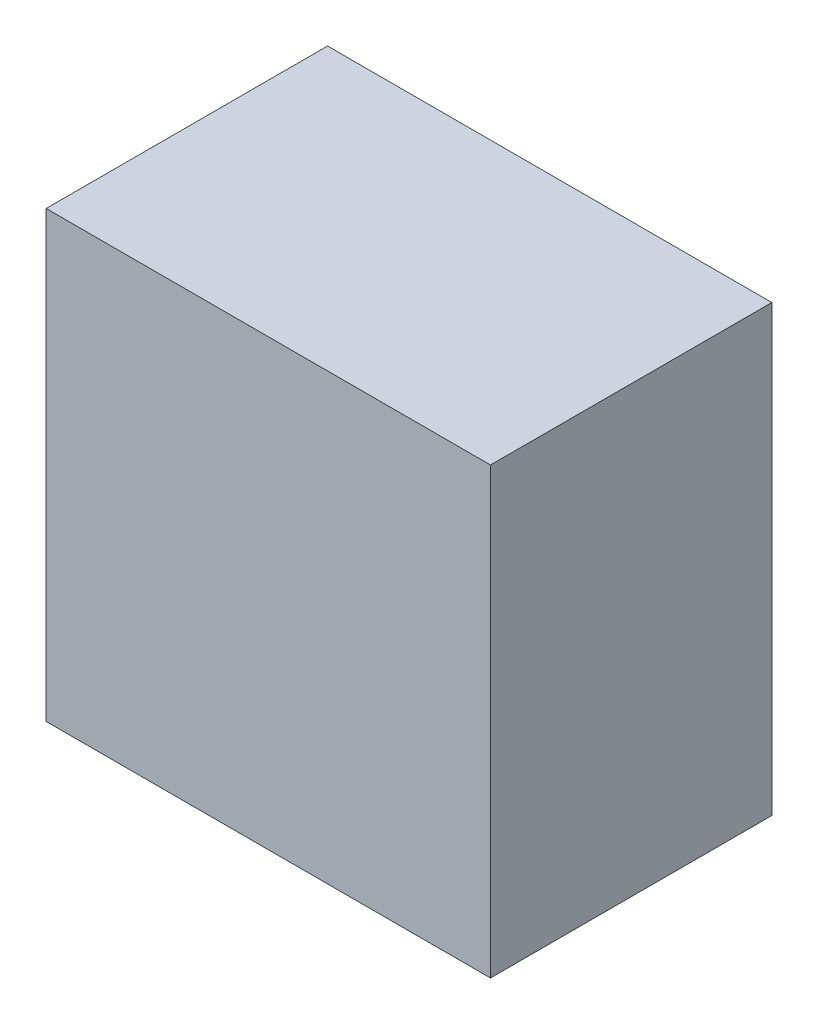
ISO-10303-21;
HEADER;
FILE_DESCRIPTION(('STEP AP214'),'2;1');
FILE_NAME('part.step','',(''),(''),'','','');
FILE_SCHEMA(('AUTOMOTIVE_DESIGN { 1 0 10303 214 1 1 1 1 }'));
ENDSEC;
DATA;
#1=APPLICATION_CONTEXT('core data for automotive mechanical design processes');
#2=APPLICATION_PROTOCOL_DEFINITION('international standard','automotive_design',2000,#1);
#3=PRODUCT_CONTEXT('',#1,'mechanical');
#4=PRODUCT('Part','Part','',(#3));
#5=PRODUCT_RELATED_PRODUCT_CATEGORY('part','',(#4));
#6=PRODUCT_DEFINITION_FORMATION('','',#4);
#7=PRODUCT_DEFINITION_CONTEXT('part definition',#1,'design');
#8=PRODUCT_DEFINITION('design','',#6,#7);
#9=PRODUCT_DEFINITION_SHAPE('','',#8);
#10=(LENGTH_UNIT() NAMED_UNIT(*) SI_UNIT(.MILLI.,.METRE.));
#11=(NAMED_UNIT(*) PLANE_ANGLE_UNIT() SI_UNIT($,.RADIAN.));
#12=(NAMED_UNIT(*) SI_UNIT($,.STERADIAN.) SOLID_ANGLE_UNIT());
#13=UNCERTAINTY_MEASURE_WITH_UNIT(LENGTH_MEASURE(1.E-05),#10,'distance_accuracy_value','');
#14=(GEOMETRIC_REPRESENTATION_CONTEXT(3) GLOBAL_UNCERTAINTY_ASSIGNED_CONTEXT((#13)) GLOBAL_UNIT_ASSIGNED_CONTEXT((#10,
#11,#12)) REPRESENTATION_CONTEXT('',''));
#15=CARTESIAN_POINT('',(0.,0.,0.));
#16=DIRECTION('',(0.,0.,1.));
#17=DIRECTION('',(1.,0.,0.));
#18=AXIS2_PLACEMENT_3D('',#15,#16,#17);
#19=CARTESIAN_POINT('',(30.,-30.,38.));
#20=DIRECTION('',(-1.,0.,0.));
#21=DIRECTION('',(0.,0.,1.));
#22=AXIS2_PLACEMENT_3D('',#19,#20,#21);
#23=PLANE('',#22);
#24=DIRECTION('',(0.,1.,0.));
#25=VECTOR('',#24,1.);
#26=CARTESIAN_POINT('',(30.,-30.,0.));
#27=LINE('',#26,#25);
#28=CARTESIAN_POINT('',(30.,-30.,0.));
#29=VERTEX_POINT('',#28);
#30=CARTESIAN_POINT('',(30.,30.,0.));
#31=VERTEX_POINT('',#30);
#32=EDGE_CURVE('E111',#29,#31,#27,.T.);
#33=ORIENTED_EDGE('',*,*,#32,.T.);
#34=DIRECTION('',(0.,0.,-1.));
#35=VECTOR('',#34,1.);
#36=CARTESIAN_POINT('',(30.,30.,38.));
#37=LINE('',#36,#35);
#38=CARTESIAN_POINT('',(30.,30.,38.));
#39=VERTEX_POINT('',#38);
#40=EDGE_CURVE('E11',#39,#31,#37,.T.);
#41=ORIENTED_EDGE('',*,*,#40,.F.);
#42=DIRECTION('',(0.,1.,0.));
#43=VECTOR('',#42,1.);
#44=CARTESIAN_POINT('',(30.,-30.,38.));
#45=LINE('',#44,#43);
#46=CARTESIAN_POINT('',(30.,-30.,38.));
#47=VERTEX_POINT('',#46);
#48=EDGE_CURVE('E95',#47,#39,#45,.T.);
#49=ORIENTED_EDGE('',*,*,#48,.F.);
#50=DIRECTION('',(0.,0.,-1.));
#51=VECTOR('',#50,1.);
#52=CARTESIAN_POINT('',(30.,-30.,38.));
#53=LINE('',#52,#51);
#54=EDGE_CURVE('E107',#47,#29,#53,.T.);
#55=ORIENTED_EDGE('',*,*,#54,.T.);
#56=EDGE_LOOP('',(#33,#41,#49,#55));
#57=FACE_BOUND('',#56,.T.);
#58=ADVANCED_FACE('F43',(#57),#23,.F.);
#59=CARTESIAN_POINT('',(-30.,30.,38.));
#60=DIRECTION('',(0.,-1.,0.));
#61=DIRECTION('',(0.,0.,-1.));
#62=AXIS2_PLACEMENT_3D('',#59,#60,#61);
#63=PLANE('',#62);
#64=DIRECTION('',(-1.,0.,0.));
#65=VECTOR('',#64,1.);
#66=CARTESIAN_POINT('',(-30.,30.,0.));
#67=LINE('',#66,#65);
#68=CARTESIAN_POINT('',(-30.,30.,0.));
#69=VERTEX_POINT('',#68);
#70=EDGE_CURVE('E100',#31,#69,#67,.T.);
#71=ORIENTED_EDGE('',*,*,#70,.T.);
#72=DIRECTION('',(0.,0.,-1.));
#73=VECTOR('',#72,1.);
#74=CARTESIAN_POINT('',(-30.,30.,38.));
#75=LINE('',#74,#73);
#76=CARTESIAN_POINT('',(-30.,30.,38.));
#77=VERTEX_POINT('',#76);
#78=EDGE_CURVE('E52',#77,#69,#75,.T.);
#79=ORIENTED_EDGE('',*,*,#78,.F.);
#80=DIRECTION('',(-1.,0.,0.));
#81=VECTOR('',#80,1.);
#82=CARTESIAN_POINT('',(-30.,30.,38.));
#83=LINE('',#82,#81);
#84=EDGE_CURVE('E90',#39,#77,#83,.T.);
#85=ORIENTED_EDGE('',*,*,#84,.F.);
#86=ORIENTED_EDGE('',*,*,#40,.T.);
#87=EDGE_LOOP('',(#71,#79,#85,#86));
#88=FACE_BOUND('',#87,.T.);
#89=ADVANCED_FACE('F99',(#88),#63,.F.);
#90=CARTESIAN_POINT('',(-30.,-30.,38.));
#91=DIRECTION('',(1.,0.,0.));
#92=DIRECTION('',(0.,0.,-1.));
#93=AXIS2_PLACEMENT_3D('',#90,#91,#92);
#94=PLANE('',#93);
#95=DIRECTION('',(0.,-1.,0.));
#96=VECTOR('',#95,1.);
#97=CARTESIAN_POINT('',(-30.,-30.,0.));
#98=LINE('',#97,#96);
#99=CARTESIAN_POINT('',(-30.,-30.,0.));
#100=VERTEX_POINT('',#99);
#101=EDGE_CURVE('E77',#69,#100,#98,.T.);
#102=ORIENTED_EDGE('',*,*,#101,.T.);
#103=DIRECTION('',(0.,0.,-1.));
#104=VECTOR('',#103,1.);
#105=CARTESIAN_POINT('',(-30.,-30.,38.));
#106=LINE('',#105,#104);
#107=CARTESIAN_POINT('',(-30.,-30.,38.));
#108=VERTEX_POINT('',#107);
#109=EDGE_CURVE('E102',#108,#100,#106,.T.);
#110=ORIENTED_EDGE('',*,*,#109,.F.);
#111=DIRECTION('',(0.,-1.,0.));
#112=VECTOR('',#111,1.);
#113=CARTESIAN_POINT('',(-30.,-30.,38.));
#114=LINE('',#113,#112);
#115=EDGE_CURVE('E93',#77,#108,#114,.T.);
#116=ORIENTED_EDGE('',*,*,#115,.F.);
#117=ORIENTED_EDGE('',*,*,#78,.T.);
#118=EDGE_LOOP('',(#102,#110,#116,#117));
#119=FACE_BOUND('',#118,.T.);
#120=ADVANCED_FACE('F103',(#119),#94,.F.);
#121=CARTESIAN_POINT('',(-30.,-30.,38.));
#122=DIRECTION('',(0.,1.,0.));
#123=DIRECTION('',(0.,0.,1.));
#124=AXIS2_PLACEMENT_3D('',#121,#122,#123);
#125=PLANE('',#124);
#126=DIRECTION('',(1.,0.,0.));
#127=VECTOR('',#126,1.);
#128=CARTESIAN_POINT('',(-30.,-30.,0.));
#129=LINE('',#128,#127);
#130=EDGE_CURVE('E83',#100,#29,#129,.T.);
#131=ORIENTED_EDGE('',*,*,#130,.T.);
#132=ORIENTED_EDGE('',*,*,#54,.F.);
#133=DIRECTION('',(1.,0.,0.));
#134=VECTOR('',#133,1.);
#135=CARTESIAN_POINT('',(-30.,-30.,38.));
#136=LINE('',#135,#134);
#137=EDGE_CURVE('E60',#108,#47,#136,.T.);
#138=ORIENTED_EDGE('',*,*,#137,.F.);
#139=ORIENTED_EDGE('',*,*,#109,.T.);
#140=EDGE_LOOP('',(#131,#132,#138,#139));
#141=FACE_BOUND('',#140,.T.);
#142=ADVANCED_FACE('F124',(#141),#125,.F.);
#143=CARTESIAN_POINT('',(0.,0.,38.));
#144=DIRECTION('',(0.,0.,-1.));
#145=DIRECTION('',(-1.,0.,0.));
#146=AXIS2_PLACEMENT_3D('',#143,#144,#145);
#147=PLANE('',#146);
#148=ORIENTED_EDGE('',*,*,#48,.T.);
#149=ORIENTED_EDGE('',*,*,#84,.T.);
#150=ORIENTED_EDGE('',*,*,#115,.T.);
#151=ORIENTED_EDGE('',*,*,#137,.T.);
#152=EDGE_LOOP('',(#148,#149,#150,#151));
#153=FACE_BOUND('',#152,.T.);
#154=ADVANCED_FACE('F91',(#153),#147,.F.);
#155=CARTESIAN_POINT('',(0.,0.,0.));
#156=DIRECTION('',(0.,0.,-1.));
#157=DIRECTION('',(-1.,0.,0.));
#158=AXIS2_PLACEMENT_3D('',#155,#156,#157);
#159=PLANE('',#158);
#160=ORIENTED_EDGE('',*,*,#32,.F.);
#161=ORIENTED_EDGE('',*,*,#130,.F.);
#162=ORIENTED_EDGE('',*,*,#101,.F.);
#163=ORIENTED_EDGE('',*,*,#70,.F.);
#164=EDGE_LOOP('',(#160,#161,#162,#163));
#165=FACE_BOUND('',#164,.T.);
#166=ADVANCED_FACE('F127',(#165),#159,.T.);
#167=CLOSED_SHELL('',(#58,#89,#120,#142,#154,#166));
#168=MANIFOLD_SOLID_BREP('B2',#167);
#169=ADVANCED_BREP_SHAPE_REPRESENTATION('',(#18,#168),#14);
#170=SHAPE_DEFINITION_REPRESENTATION(#9,#169);
ENDSEC;
END-ISO-10303-21;
